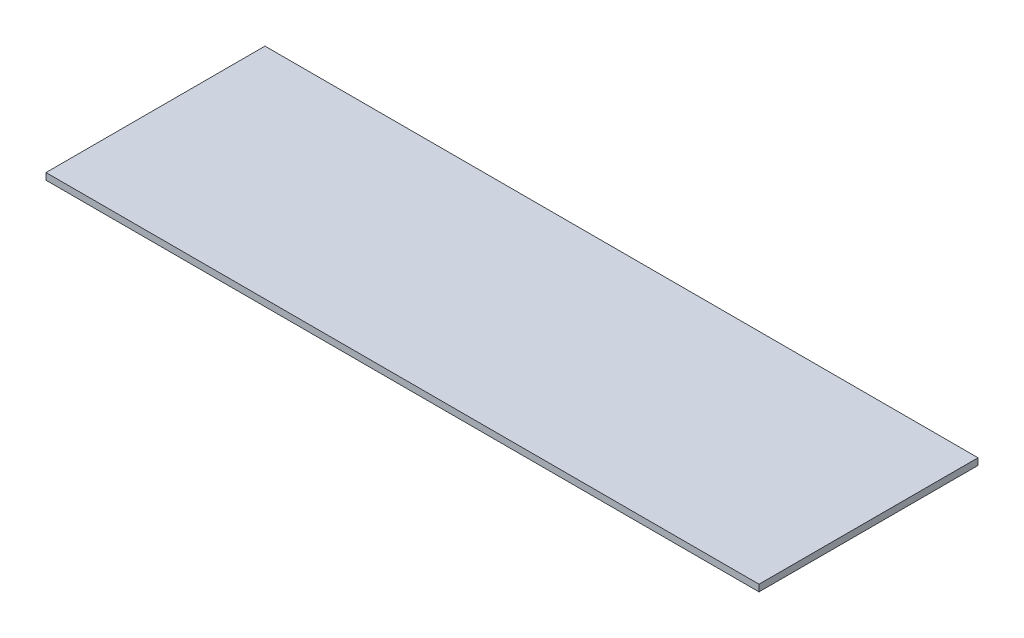
ISO-10303-21;
HEADER;
FILE_DESCRIPTION(('STEP AP214'),'2;1');
FILE_NAME('part.step','',(''),(''),'','','');
FILE_SCHEMA(('AUTOMOTIVE_DESIGN { 1 0 10303 214 1 1 1 1 }'));
ENDSEC;
DATA;
#1=APPLICATION_CONTEXT('core data for automotive mechanical design processes');
#2=APPLICATION_PROTOCOL_DEFINITION('international standard','automotive_design',2000,#1);
#3=PRODUCT_CONTEXT('',#1,'mechanical');
#4=PRODUCT('Part','Part','',(#3));
#5=PRODUCT_RELATED_PRODUCT_CATEGORY('part','',(#4));
#6=PRODUCT_DEFINITION_FORMATION('','',#4);
#7=PRODUCT_DEFINITION_CONTEXT('part definition',#1,'design');
#8=PRODUCT_DEFINITION('design','',#6,#7);
#9=PRODUCT_DEFINITION_SHAPE('','',#8);
#10=(LENGTH_UNIT() NAMED_UNIT(*) SI_UNIT(.MILLI.,.METRE.));
#11=(NAMED_UNIT(*) PLANE_ANGLE_UNIT() SI_UNIT($,.RADIAN.));
#12=(NAMED_UNIT(*) SI_UNIT($,.STERADIAN.) SOLID_ANGLE_UNIT());
#13=UNCERTAINTY_MEASURE_WITH_UNIT(LENGTH_MEASURE(1.E-05),#10,'distance_accuracy_value','');
#14=(GEOMETRIC_REPRESENTATION_CONTEXT(3) GLOBAL_UNCERTAINTY_ASSIGNED_CONTEXT((#13)) GLOBAL_UNIT_ASSIGNED_CONTEXT((#10,
#11,#12)) REPRESENTATION_CONTEXT('',''));
#15=CARTESIAN_POINT('',(0.,0.,0.));
#16=DIRECTION('',(0.,0.,1.));
#17=DIRECTION('',(1.,0.,0.));
#18=AXIS2_PLACEMENT_3D('',#15,#16,#17);
#19=CARTESIAN_POINT('',(160.,3.,-49.14));
#20=DIRECTION('',(-1.,0.,0.));
#21=DIRECTION('',(0.,0.,1.));
#22=AXIS2_PLACEMENT_3D('',#19,#20,#21);
#23=PLANE('',#22);
#24=DIRECTION('',(0.,0.,-1.));
#25=VECTOR('',#24,1.);
#26=CARTESIAN_POINT('',(160.,0.,-49.14));
#27=LINE('',#26,#25);
#28=CARTESIAN_POINT('',(160.,0.,49.14));
#29=VERTEX_POINT('',#28);
#30=CARTESIAN_POINT('',(160.,0.,-49.14));
#31=VERTEX_POINT('',#30);
#32=EDGE_CURVE('E98',#29,#31,#27,.T.);
#33=ORIENTED_EDGE('',*,*,#32,.T.);
#34=DIRECTION('',(0.,-1.,0.));
#35=VECTOR('',#34,1.);
#36=CARTESIAN_POINT('',(160.,3.,-49.14));
#37=LINE('',#36,#35);
#38=CARTESIAN_POINT('',(160.,3.,-49.14));
#39=VERTEX_POINT('',#38);
#40=EDGE_CURVE('E11',#39,#31,#37,.T.);
#41=ORIENTED_EDGE('',*,*,#40,.F.);
#42=DIRECTION('',(0.,0.,-1.));
#43=VECTOR('',#42,1.);
#44=CARTESIAN_POINT('',(160.,3.,-49.14));
#45=LINE('',#44,#43);
#46=CARTESIAN_POINT('',(160.,3.,49.14));
#47=VERTEX_POINT('',#46);
#48=EDGE_CURVE('E86',#47,#39,#45,.T.);
#49=ORIENTED_EDGE('',*,*,#48,.F.);
#50=DIRECTION('',(0.,-1.,0.));
#51=VECTOR('',#50,1.);
#52=CARTESIAN_POINT('',(160.,3.,49.14));
#53=LINE('',#52,#51);
#54=EDGE_CURVE('E94',#47,#29,#53,.T.);
#55=ORIENTED_EDGE('',*,*,#54,.T.);
#56=EDGE_LOOP('',(#33,#41,#49,#55));
#57=FACE_BOUND('',#56,.T.);
#58=ADVANCED_FACE('F35',(#57),#23,.F.);
#59=CARTESIAN_POINT('',(-160.,3.,-49.14));
#60=DIRECTION('',(0.,0.,1.));
#61=DIRECTION('',(1.,0.,0.));
#62=AXIS2_PLACEMENT_3D('',#59,#60,#61);
#63=PLANE('',#62);
#64=DIRECTION('',(-1.,0.,0.));
#65=VECTOR('',#64,1.);
#66=CARTESIAN_POINT('',(-160.,0.,-49.14));
#67=LINE('',#66,#65);
#68=CARTESIAN_POINT('',(-160.,0.,-49.14));
#69=VERTEX_POINT('',#68);
#70=EDGE_CURVE('E90',#31,#69,#67,.T.);
#71=ORIENTED_EDGE('',*,*,#70,.T.);
#72=DIRECTION('',(0.,-1.,0.));
#73=VECTOR('',#72,1.);
#74=CARTESIAN_POINT('',(-160.,3.,-49.14));
#75=LINE('',#74,#73);
#76=CARTESIAN_POINT('',(-160.,3.,-49.14));
#77=VERTEX_POINT('',#76);
#78=EDGE_CURVE('E43',#77,#69,#75,.T.);
#79=ORIENTED_EDGE('',*,*,#78,.F.);
#80=DIRECTION('',(-1.,0.,0.));
#81=VECTOR('',#80,1.);
#82=CARTESIAN_POINT('',(-160.,3.,-49.14));
#83=LINE('',#82,#81);
#84=EDGE_CURVE('E81',#39,#77,#83,.T.);
#85=ORIENTED_EDGE('',*,*,#84,.F.);
#86=ORIENTED_EDGE('',*,*,#40,.T.);
#87=EDGE_LOOP('',(#71,#79,#85,#86));
#88=FACE_BOUND('',#87,.T.);
#89=ADVANCED_FACE('F89',(#88),#63,.F.);
#90=CARTESIAN_POINT('',(-160.,3.,-49.14));
#91=DIRECTION('',(1.,0.,0.));
#92=DIRECTION('',(0.,0.,-1.));
#93=AXIS2_PLACEMENT_3D('',#90,#91,#92);
#94=PLANE('',#93);
#95=DIRECTION('',(0.,0.,1.));
#96=VECTOR('',#95,1.);
#97=CARTESIAN_POINT('',(-160.,0.,-49.14));
#98=LINE('',#97,#96);
#99=CARTESIAN_POINT('',(-160.,0.,49.14));
#100=VERTEX_POINT('',#99);
#101=EDGE_CURVE('E68',#69,#100,#98,.T.);
#102=ORIENTED_EDGE('',*,*,#101,.T.);
#103=DIRECTION('',(0.,-1.,0.));
#104=VECTOR('',#103,1.);
#105=CARTESIAN_POINT('',(-160.,3.,49.14));
#106=LINE('',#105,#104);
#107=CARTESIAN_POINT('',(-160.,3.,49.14));
#108=VERTEX_POINT('',#107);
#109=EDGE_CURVE('E91',#108,#100,#106,.T.);
#110=ORIENTED_EDGE('',*,*,#109,.F.);
#111=DIRECTION('',(0.,0.,1.));
#112=VECTOR('',#111,1.);
#113=CARTESIAN_POINT('',(-160.,3.,-49.14));
#114=LINE('',#113,#112);
#115=EDGE_CURVE('E84',#77,#108,#114,.T.);
#116=ORIENTED_EDGE('',*,*,#115,.F.);
#117=ORIENTED_EDGE('',*,*,#78,.T.);
#118=EDGE_LOOP('',(#102,#110,#116,#117));
#119=FACE_BOUND('',#118,.T.);
#120=ADVANCED_FACE('F92',(#119),#94,.F.);
#121=CARTESIAN_POINT('',(-160.,3.,49.14));
#122=DIRECTION('',(0.,0.,-1.));
#123=DIRECTION('',(-1.,0.,0.));
#124=AXIS2_PLACEMENT_3D('',#121,#122,#123);
#125=PLANE('',#124);
#126=DIRECTION('',(1.,0.,0.));
#127=VECTOR('',#126,1.);
#128=CARTESIAN_POINT('',(-160.,0.,49.14));
#129=LINE('',#128,#127);
#130=EDGE_CURVE('E74',#100,#29,#129,.T.);
#131=ORIENTED_EDGE('',*,*,#130,.T.);
#132=ORIENTED_EDGE('',*,*,#54,.F.);
#133=DIRECTION('',(1.,0.,0.));
#134=VECTOR('',#133,1.);
#135=CARTESIAN_POINT('',(-160.,3.,49.14));
#136=LINE('',#135,#134);
#137=EDGE_CURVE('E51',#108,#47,#136,.T.);
#138=ORIENTED_EDGE('',*,*,#137,.F.);
#139=ORIENTED_EDGE('',*,*,#109,.T.);
#140=EDGE_LOOP('',(#131,#132,#138,#139));
#141=FACE_BOUND('',#140,.T.);
#142=ADVANCED_FACE('F105',(#141),#125,.F.);
#143=CARTESIAN_POINT('',(0.,3.,0.));
#144=DIRECTION('',(0.,1.,0.));
#145=DIRECTION('',(0.,0.,1.));
#146=AXIS2_PLACEMENT_3D('',#143,#144,#145);
#147=PLANE('',#146);
#148=ORIENTED_EDGE('',*,*,#48,.T.);
#149=ORIENTED_EDGE('',*,*,#84,.T.);
#150=ORIENTED_EDGE('',*,*,#115,.T.);
#151=ORIENTED_EDGE('',*,*,#137,.T.);
#152=EDGE_LOOP('',(#148,#149,#150,#151));
#153=FACE_BOUND('',#152,.T.);
#154=ADVANCED_FACE('F82',(#153),#147,.T.);
#155=CARTESIAN_POINT('',(0.,0.,0.));
#156=DIRECTION('',(0.,1.,0.));
#157=DIRECTION('',(0.,0.,1.));
#158=AXIS2_PLACEMENT_3D('',#155,#156,#157);
#159=PLANE('',#158);
#160=ORIENTED_EDGE('',*,*,#32,.F.);
#161=ORIENTED_EDGE('',*,*,#130,.F.);
#162=ORIENTED_EDGE('',*,*,#101,.F.);
#163=ORIENTED_EDGE('',*,*,#70,.F.);
#164=EDGE_LOOP('',(#160,#161,#162,#163));
#165=FACE_BOUND('',#164,.T.);
#166=ADVANCED_FACE('F108',(#165),#159,.F.);
#167=CLOSED_SHELL('',(#58,#89,#120,#142,#154,#166));
#168=MANIFOLD_SOLID_BREP('B2',#167);
#169=ADVANCED_BREP_SHAPE_REPRESENTATION('',(#18,#168),#14);
#170=SHAPE_DEFINITION_REPRESENTATION(#9,#169);
ENDSEC;
END-ISO-10303-21;
